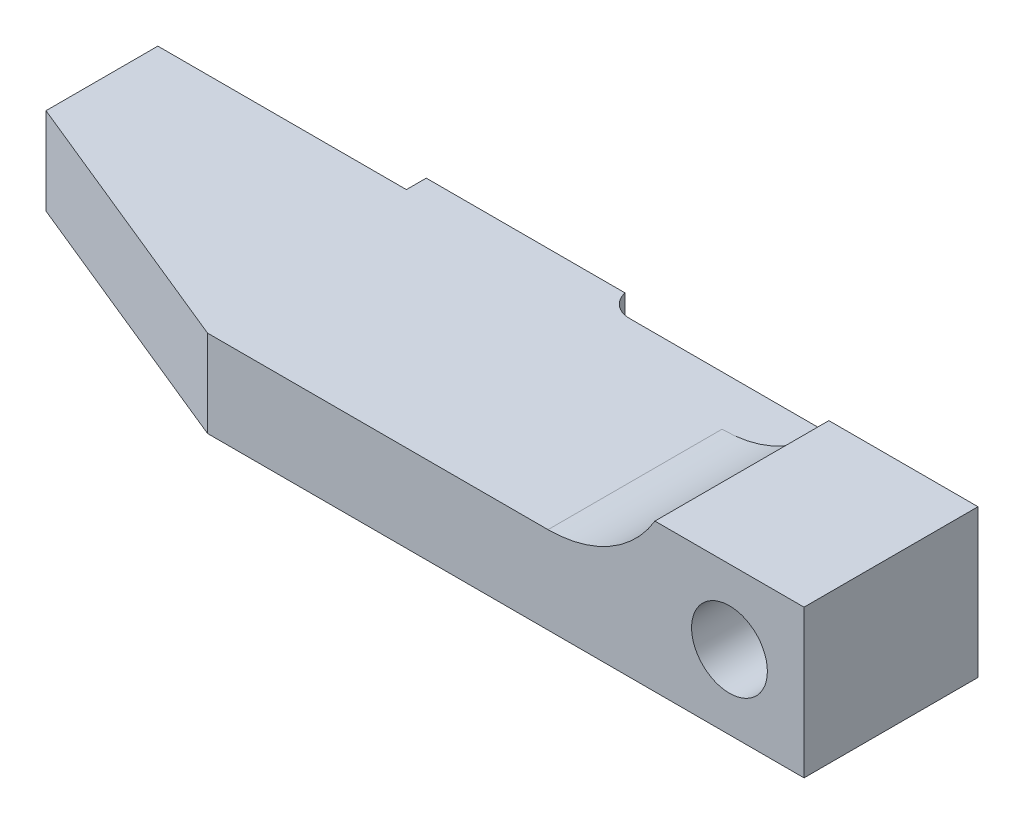
ISO-10303-21;
HEADER;
FILE_DESCRIPTION(('STEP AP214'),'2;1');
FILE_NAME('part.step','',(''),(''),'','','');
FILE_SCHEMA(('AUTOMOTIVE_DESIGN { 1 0 10303 214 1 1 1 1 }'));
ENDSEC;
DATA;
#1=APPLICATION_CONTEXT('core data for automotive mechanical design processes');
#2=APPLICATION_PROTOCOL_DEFINITION('international standard','automotive_design',2000,#1);
#3=PRODUCT_CONTEXT('',#1,'mechanical');
#4=PRODUCT('Part','Part','',(#3));
#5=PRODUCT_RELATED_PRODUCT_CATEGORY('part','',(#4));
#6=PRODUCT_DEFINITION_FORMATION('','',#4);
#7=PRODUCT_DEFINITION_CONTEXT('part definition',#1,'design');
#8=PRODUCT_DEFINITION('design','',#6,#7);
#9=PRODUCT_DEFINITION_SHAPE('','',#8);
#10=(LENGTH_UNIT() NAMED_UNIT(*) SI_UNIT(.MILLI.,.METRE.));
#11=(NAMED_UNIT(*) PLANE_ANGLE_UNIT() SI_UNIT($,.RADIAN.));
#12=(NAMED_UNIT(*) SI_UNIT($,.STERADIAN.) SOLID_ANGLE_UNIT());
#13=UNCERTAINTY_MEASURE_WITH_UNIT(LENGTH_MEASURE(1.E-05),#10,'distance_accuracy_value','');
#14=(GEOMETRIC_REPRESENTATION_CONTEXT(3) GLOBAL_UNCERTAINTY_ASSIGNED_CONTEXT((#13)) GLOBAL_UNIT_ASSIGNED_CONTEXT((#10,
#11,#12)) REPRESENTATION_CONTEXT('',''));
#15=CARTESIAN_POINT('',(0.,0.,0.));
#16=DIRECTION('',(0.,0.,1.));
#17=DIRECTION('',(1.,0.,0.));
#18=AXIS2_PLACEMENT_3D('',#15,#16,#17);
#19=CARTESIAN_POINT('',(0.,0.,0.));
#20=DIRECTION('',(0.,1.,0.));
#21=DIRECTION('',(0.,0.,1.));
#22=AXIS2_PLACEMENT_3D('',#19,#20,#21);
#23=PLANE('',#22);
#24=DIRECTION('',(-1.,0.,0.));
#25=VECTOR('',#24,1.);
#26=CARTESIAN_POINT('',(0.,0.,-9.));
#27=LINE('',#26,#25);
#28=CARTESIAN_POINT('',(-7.,0.,-9.));
#29=VERTEX_POINT('',#28);
#30=CARTESIAN_POINT('',(-16.0202041028867,0.,-9.));
#31=VERTEX_POINT('',#30);
#32=EDGE_CURVE('E208',#29,#31,#27,.T.);
#33=ORIENTED_EDGE('',*,*,#32,.F.);
#34=CARTESIAN_POINT('',(-7.,0.,-8.));
#35=DIRECTION('',(0.,1.,0.));
#36=DIRECTION('',(0.,0.,1.));
#37=AXIS2_PLACEMENT_3D('',#34,#35,#36);
#38=CIRCLE('',#37,1.);
#39=CARTESIAN_POINT('',(-6.,0.,-8.));
#40=VERTEX_POINT('',#39);
#41=EDGE_CURVE('E161',#29,#40,#38,.F.);
#42=ORIENTED_EDGE('',*,*,#41,.T.);
#43=DIRECTION('',(0.,0.,-1.));
#44=VECTOR('',#43,1.);
#45=CARTESIAN_POINT('',(-6.,0.,-7.));
#46=LINE('',#45,#44);
#47=CARTESIAN_POINT('',(-6.,0.,-7.));
#48=VERTEX_POINT('',#47);
#49=EDGE_CURVE('E144',#48,#40,#46,.T.);
#50=ORIENTED_EDGE('',*,*,#49,.F.);
#51=DIRECTION('',(1.,0.,0.));
#52=VECTOR('',#51,1.);
#53=CARTESIAN_POINT('',(-6.,0.,-7.));
#54=LINE('',#53,#52);
#55=CARTESIAN_POINT('',(0.,0.,-7.));
#56=VERTEX_POINT('',#55);
#57=EDGE_CURVE('E150',#48,#56,#54,.T.);
#58=ORIENTED_EDGE('',*,*,#57,.T.);
#59=DIRECTION('',(0.,0.,-1.));
#60=VECTOR('',#59,1.);
#61=CARTESIAN_POINT('',(0.,0.,0.));
#62=LINE('',#61,#60);
#63=CARTESIAN_POINT('',(0.,0.,0.));
#64=VERTEX_POINT('',#63);
#65=EDGE_CURVE('E190',#64,#56,#62,.T.);
#66=ORIENTED_EDGE('',*,*,#65,.F.);
#67=DIRECTION('',(1.,0.,0.));
#68=VECTOR('',#67,1.);
#69=CARTESIAN_POINT('',(-8.,0.,0.));
#70=LINE('',#69,#68);
#71=CARTESIAN_POINT('',(-24.,0.,0.));
#72=VERTEX_POINT('',#71);
#73=EDGE_CURVE('E195',#72,#64,#70,.T.);
#74=ORIENTED_EDGE('',*,*,#73,.F.);
#75=DIRECTION('',(0.925546956205677,0.,0.378632845720504));
#76=VECTOR('',#75,1.);
#77=CARTESIAN_POINT('',(-24.,0.,0.));
#78=LINE('',#77,#76);
#79=CARTESIAN_POINT('',(-35.,0.,-4.5));
#80=VERTEX_POINT('',#79);
#81=EDGE_CURVE('E216',#80,#72,#78,.T.);
#82=ORIENTED_EDGE('',*,*,#81,.F.);
#83=DIRECTION('',(0.,0.,1.));
#84=VECTOR('',#83,1.);
#85=CARTESIAN_POINT('',(-35.,0.,-9.));
#86=LINE('',#85,#84);
#87=CARTESIAN_POINT('',(-35.,0.,-9.));
#88=VERTEX_POINT('',#87);
#89=EDGE_CURVE('E214',#88,#80,#86,.T.);
#90=ORIENTED_EDGE('',*,*,#89,.F.);
#91=DIRECTION('',(-1.,0.,0.));
#92=VECTOR('',#91,1.);
#93=CARTESIAN_POINT('',(-34.,0.,-9.));
#94=LINE('',#93,#92);
#95=CARTESIAN_POINT('',(-25.,0.,-9.));
#96=VERTEX_POINT('',#95);
#97=EDGE_CURVE('E212',#96,#88,#94,.T.);
#98=ORIENTED_EDGE('',*,*,#97,.F.);
#99=DIRECTION('',(0.,0.,1.));
#100=VECTOR('',#99,1.);
#101=CARTESIAN_POINT('',(-25.,0.,-12.));
#102=LINE('',#101,#100);
#103=CARTESIAN_POINT('',(-25.,0.,-9.8));
#104=VERTEX_POINT('',#103);
#105=EDGE_CURVE('E210',#104,#96,#102,.T.);
#106=ORIENTED_EDGE('',*,*,#105,.F.);
#107=DIRECTION('',(1.,0.,0.));
#108=VECTOR('',#107,1.);
#109=CARTESIAN_POINT('',(-25.,0.,-9.8));
#110=LINE('',#109,#108);
#111=CARTESIAN_POINT('',(-17.,0.,-9.8));
#112=VERTEX_POINT('',#111);
#113=EDGE_CURVE('E165',#104,#112,#110,.T.);
#114=ORIENTED_EDGE('',*,*,#113,.T.);
#115=CARTESIAN_POINT('',(-16.0202041028867,0.,-10.));
#116=DIRECTION('',(0.,1.,0.));
#117=DIRECTION('',(0.,0.,1.));
#118=AXIS2_PLACEMENT_3D('',#115,#116,#117);
#119=CIRCLE('',#118,1.);
#120=EDGE_CURVE('E44',#112,#31,#119,.T.);
#121=ORIENTED_EDGE('',*,*,#120,.T.);
#122=EDGE_LOOP('',(#33,#42,#50,#58,#66,#74,#82,#90,#98,#106,#114,#121));
#123=FACE_BOUND('',#122,.T.);
#124=ADVANCED_FACE('F36',(#123),#23,.F.);
#125=CARTESIAN_POINT('',(0.,3.5,-9.));
#126=DIRECTION('',(0.,0.,1.));
#127=DIRECTION('',(1.,0.,0.));
#128=AXIS2_PLACEMENT_3D('',#125,#126,#127);
#129=PLANE('',#128);
#130=ORIENTED_EDGE('',*,*,#32,.T.);
#131=DIRECTION('',(0.,-1.,0.));
#132=VECTOR('',#131,1.);
#133=CARTESIAN_POINT('',(-16.0202041028867,3.5,-9.));
#134=LINE('',#133,#132);
#135=CARTESIAN_POINT('',(-16.0202041028867,3.5,-9.));
#136=VERTEX_POINT('',#135);
#137=EDGE_CURVE('E57',#31,#136,#134,.F.);
#138=ORIENTED_EDGE('',*,*,#137,.T.);
#139=DIRECTION('',(-1.,0.,0.));
#140=VECTOR('',#139,1.);
#141=CARTESIAN_POINT('',(0.,3.5,-9.));
#142=LINE('',#141,#140);
#143=CARTESIAN_POINT('',(-7.,3.5,-9.));
#144=VERTEX_POINT('',#143);
#145=EDGE_CURVE('E194',#144,#136,#142,.T.);
#146=ORIENTED_EDGE('',*,*,#145,.F.);
#147=DIRECTION('',(0.,-1.,0.));
#148=VECTOR('',#147,1.);
#149=CARTESIAN_POINT('',(-7.,0.,-9.));
#150=LINE('',#149,#148);
#151=EDGE_CURVE('E243',#144,#29,#150,.T.);
#152=ORIENTED_EDGE('',*,*,#151,.T.);
#153=EDGE_LOOP('',(#130,#138,#146,#152));
#154=FACE_BOUND('',#153,.T.);
#155=ADVANCED_FACE('F303',(#154),#129,.F.);
#156=CARTESIAN_POINT('',(0.,3.5,0.));
#157=DIRECTION('',(0.,1.,0.));
#158=DIRECTION('',(0.,0.,1.));
#159=AXIS2_PLACEMENT_3D('',#156,#157,#158);
#160=PLANE('',#159);
#161=DIRECTION('',(1.,0.,0.));
#162=VECTOR('',#161,1.);
#163=CARTESIAN_POINT('',(0.,3.5,-7.));
#164=LINE('',#163,#162);
#165=CARTESIAN_POINT('',(-10.3008720046056,3.5,-7.));
#166=VERTEX_POINT('',#165);
#167=CARTESIAN_POINT('',(-7.,3.5,-7.));
#168=VERTEX_POINT('',#167);
#169=EDGE_CURVE('E232',#166,#168,#164,.T.);
#170=ORIENTED_EDGE('',*,*,#169,.T.);
#171=DIRECTION('',(0.,0.,-1.));
#172=VECTOR('',#171,1.);
#173=CARTESIAN_POINT('',(-7.,3.5,0.));
#174=LINE('',#173,#172);
#175=EDGE_CURVE('E250',#168,#144,#174,.T.);
#176=ORIENTED_EDGE('',*,*,#175,.T.);
#177=ORIENTED_EDGE('',*,*,#145,.T.);
#178=CARTESIAN_POINT('',(-16.0202041028867,3.5,-10.));
#179=DIRECTION('',(0.,1.,0.));
#180=DIRECTION('',(0.,0.,1.));
#181=AXIS2_PLACEMENT_3D('',#178,#179,#180);
#182=CIRCLE('',#181,1.);
#183=CARTESIAN_POINT('',(-17.,3.5,-9.8));
#184=VERTEX_POINT('',#183);
#185=EDGE_CURVE('E11',#136,#184,#182,.F.);
#186=ORIENTED_EDGE('',*,*,#185,.T.);
#187=DIRECTION('',(-1.,0.,0.));
#188=VECTOR('',#187,1.);
#189=CARTESIAN_POINT('',(0.,3.5,-9.8));
#190=LINE('',#189,#188);
#191=CARTESIAN_POINT('',(-25.,3.5,-9.8));
#192=VERTEX_POINT('',#191);
#193=EDGE_CURVE('E176',#184,#192,#190,.T.);
#194=ORIENTED_EDGE('',*,*,#193,.T.);
#195=DIRECTION('',(0.,0.,1.));
#196=VECTOR('',#195,1.);
#197=CARTESIAN_POINT('',(-25.,3.5,-12.));
#198=LINE('',#197,#196);
#199=CARTESIAN_POINT('',(-25.,3.5,-9.));
#200=VERTEX_POINT('',#199);
#201=EDGE_CURVE('E197',#192,#200,#198,.T.);
#202=ORIENTED_EDGE('',*,*,#201,.T.);
#203=DIRECTION('',(-1.,0.,0.));
#204=VECTOR('',#203,1.);
#205=CARTESIAN_POINT('',(-34.,3.5,-9.));
#206=LINE('',#205,#204);
#207=CARTESIAN_POINT('',(-35.,3.5,-9.));
#208=VERTEX_POINT('',#207);
#209=EDGE_CURVE('E199',#200,#208,#206,.T.);
#210=ORIENTED_EDGE('',*,*,#209,.T.);
#211=DIRECTION('',(0.,0.,1.));
#212=VECTOR('',#211,1.);
#213=CARTESIAN_POINT('',(-35.,3.5,-9.));
#214=LINE('',#213,#212);
#215=CARTESIAN_POINT('',(-35.,3.5,-4.5));
#216=VERTEX_POINT('',#215);
#217=EDGE_CURVE('E201',#208,#216,#214,.T.);
#218=ORIENTED_EDGE('',*,*,#217,.T.);
#219=DIRECTION('',(0.925546956205677,0.,0.378632845720504));
#220=VECTOR('',#219,1.);
#221=CARTESIAN_POINT('',(-24.,3.5,0.));
#222=LINE('',#221,#220);
#223=CARTESIAN_POINT('',(-24.,3.5,0.));
#224=VERTEX_POINT('',#223);
#225=EDGE_CURVE('E203',#216,#224,#222,.T.);
#226=ORIENTED_EDGE('',*,*,#225,.T.);
#227=DIRECTION('',(1.,0.,0.));
#228=VECTOR('',#227,1.);
#229=CARTESIAN_POINT('',(0.,3.5,0.));
#230=LINE('',#229,#228);
#231=CARTESIAN_POINT('',(-10.3008720046056,3.5,0.));
#232=VERTEX_POINT('',#231);
#233=EDGE_CURVE('E191',#224,#232,#230,.T.);
#234=ORIENTED_EDGE('',*,*,#233,.T.);
#235=DIRECTION('',(0.,0.,1.));
#236=VECTOR('',#235,1.);
#237=CARTESIAN_POINT('',(-10.3008720046056,3.5,-7.));
#238=LINE('',#237,#236);
#239=EDGE_CURVE('E236',#232,#166,#238,.F.);
#240=ORIENTED_EDGE('',*,*,#239,.T.);
#241=EDGE_LOOP('',(#170,#176,#177,#186,#194,#202,#210,#218,#226,#234,#240));
#242=FACE_BOUND('',#241,.T.);
#243=ADVANCED_FACE('F275',(#242),#160,.T.);
#244=CARTESIAN_POINT('',(-25.,3.5,-12.));
#245=DIRECTION('',(1.,0.,0.));
#246=DIRECTION('',(0.,0.,-1.));
#247=AXIS2_PLACEMENT_3D('',#244,#245,#246);
#248=PLANE('',#247);
#249=DIRECTION('',(0.,-1.,0.));
#250=VECTOR('',#249,1.);
#251=CARTESIAN_POINT('',(-25.,10.,-9.8));
#252=LINE('',#251,#250);
#253=EDGE_CURVE('E173',#192,#104,#252,.T.);
#254=ORIENTED_EDGE('',*,*,#253,.T.);
#255=ORIENTED_EDGE('',*,*,#105,.T.);
#256=DIRECTION('',(0.,-1.,0.));
#257=VECTOR('',#256,1.);
#258=CARTESIAN_POINT('',(-25.,3.5,-9.));
#259=LINE('',#258,#257);
#260=EDGE_CURVE('E227',#200,#96,#259,.T.);
#261=ORIENTED_EDGE('',*,*,#260,.F.);
#262=ORIENTED_EDGE('',*,*,#201,.F.);
#263=EDGE_LOOP('',(#254,#255,#261,#262));
#264=FACE_BOUND('',#263,.T.);
#265=ADVANCED_FACE('F289',(#264),#248,.F.);
#266=CARTESIAN_POINT('',(0.,3.5,0.));
#267=DIRECTION('',(-1.,0.,0.));
#268=DIRECTION('',(0.,0.,1.));
#269=AXIS2_PLACEMENT_3D('',#266,#267,#268);
#270=PLANE('',#269);
#271=ORIENTED_EDGE('',*,*,#65,.T.);
#272=DIRECTION('',(0.,1.,0.));
#273=VECTOR('',#272,1.);
#274=CARTESIAN_POINT('',(0.,0.,-7.));
#275=LINE('',#274,#273);
#276=CARTESIAN_POINT('',(0.,5.95,-7.));
#277=VERTEX_POINT('',#276);
#278=EDGE_CURVE('E157',#56,#277,#275,.T.);
#279=ORIENTED_EDGE('',*,*,#278,.T.);
#280=DIRECTION('',(0.,0.,-1.));
#281=VECTOR('',#280,1.);
#282=CARTESIAN_POINT('',(0.,5.95,-9.));
#283=LINE('',#282,#281);
#284=CARTESIAN_POINT('',(0.,5.95,0.));
#285=VERTEX_POINT('',#284);
#286=EDGE_CURVE('E182',#285,#277,#283,.T.);
#287=ORIENTED_EDGE('',*,*,#286,.F.);
#288=DIRECTION('',(0.,-1.,0.));
#289=VECTOR('',#288,1.);
#290=CARTESIAN_POINT('',(0.,3.5,0.));
#291=LINE('',#290,#289);
#292=EDGE_CURVE('E230',#285,#64,#291,.T.);
#293=ORIENTED_EDGE('',*,*,#292,.T.);
#294=EDGE_LOOP('',(#271,#279,#287,#293));
#295=FACE_BOUND('',#294,.T.);
#296=ADVANCED_FACE('F286',(#295),#270,.F.);
#297=CARTESIAN_POINT('',(-34.,3.5,-9.));
#298=DIRECTION('',(0.,0.,1.));
#299=DIRECTION('',(1.,0.,0.));
#300=AXIS2_PLACEMENT_3D('',#297,#298,#299);
#301=PLANE('',#300);
#302=ORIENTED_EDGE('',*,*,#97,.T.);
#303=DIRECTION('',(0.,-1.,0.));
#304=VECTOR('',#303,1.);
#305=CARTESIAN_POINT('',(-35.,3.5,-9.));
#306=LINE('',#305,#304);
#307=EDGE_CURVE('E224',#208,#88,#306,.T.);
#308=ORIENTED_EDGE('',*,*,#307,.F.);
#309=ORIENTED_EDGE('',*,*,#209,.F.);
#310=ORIENTED_EDGE('',*,*,#260,.T.);
#311=EDGE_LOOP('',(#302,#308,#309,#310));
#312=FACE_BOUND('',#311,.T.);
#313=ADVANCED_FACE('F288',(#312),#301,.F.);
#314=CARTESIAN_POINT('',(-35.,3.5,-9.));
#315=DIRECTION('',(1.,0.,0.));
#316=DIRECTION('',(0.,0.,-1.));
#317=AXIS2_PLACEMENT_3D('',#314,#315,#316);
#318=PLANE('',#317);
#319=ORIENTED_EDGE('',*,*,#89,.T.);
#320=DIRECTION('',(0.,-1.,0.));
#321=VECTOR('',#320,1.);
#322=CARTESIAN_POINT('',(-35.,3.5,-4.5));
#323=LINE('',#322,#321);
#324=EDGE_CURVE('E221',#216,#80,#323,.T.);
#325=ORIENTED_EDGE('',*,*,#324,.F.);
#326=ORIENTED_EDGE('',*,*,#217,.F.);
#327=ORIENTED_EDGE('',*,*,#307,.T.);
#328=EDGE_LOOP('',(#319,#325,#326,#327));
#329=FACE_BOUND('',#328,.T.);
#330=ADVANCED_FACE('F295',(#329),#318,.F.);
#331=CARTESIAN_POINT('',(-24.,3.5,0.));
#332=DIRECTION('',(0.378632845720504,0.,-0.925546956205677));
#333=DIRECTION('',(-0.925546956205677,0.,-0.378632845720504));
#334=AXIS2_PLACEMENT_3D('',#331,#332,#333);
#335=PLANE('',#334);
#336=ORIENTED_EDGE('',*,*,#81,.T.);
#337=DIRECTION('',(0.,-1.,0.));
#338=VECTOR('',#337,1.);
#339=CARTESIAN_POINT('',(-24.,3.5,0.));
#340=LINE('',#339,#338);
#341=EDGE_CURVE('E206',#224,#72,#340,.T.);
#342=ORIENTED_EDGE('',*,*,#341,.F.);
#343=ORIENTED_EDGE('',*,*,#225,.F.);
#344=ORIENTED_EDGE('',*,*,#324,.T.);
#345=EDGE_LOOP('',(#336,#342,#343,#344));
#346=FACE_BOUND('',#345,.T.);
#347=ADVANCED_FACE('F281',(#346),#335,.F.);
#348=CARTESIAN_POINT('',(-8.,3.5,0.));
#349=DIRECTION('',(0.,0.,-1.));
#350=DIRECTION('',(-1.,0.,0.));
#351=AXIS2_PLACEMENT_3D('',#348,#349,#350);
#352=PLANE('',#351);
#353=CARTESIAN_POINT('',(-3.,2.975,0.));
#354=DIRECTION('',(0.,0.,1.));
#355=DIRECTION('',(1.,0.,0.));
#356=AXIS2_PLACEMENT_3D('',#353,#354,#355);
#357=CIRCLE('',#356,1.525);
#358=CARTESIAN_POINT('',(-1.475,2.975,0.));
#359=VERTEX_POINT('',#358);
#360=EDGE_CURVE('E179',#359,#359,#357,.T.);
#361=ORIENTED_EDGE('',*,*,#360,.F.);
#362=EDGE_LOOP('',(#361));
#363=FACE_BOUND('',#362,.T.);
#364=ORIENTED_EDGE('',*,*,#292,.F.);
#365=DIRECTION('',(1.,0.,0.));
#366=VECTOR('',#365,1.);
#367=CARTESIAN_POINT('',(0.,5.95,0.));
#368=LINE('',#367,#366);
#369=CARTESIAN_POINT('',(-6.,5.95,0.));
#370=VERTEX_POINT('',#369);
#371=EDGE_CURVE('E187',#370,#285,#368,.T.);
#372=ORIENTED_EDGE('',*,*,#371,.F.);
#373=CARTESIAN_POINT('',(-10.3008720046056,8.5,0.));
#374=DIRECTION('',(0.,0.,-1.));
#375=DIRECTION('',(-1.,0.,0.));
#376=AXIS2_PLACEMENT_3D('',#373,#374,#375);
#377=CIRCLE('',#376,5.);
#378=EDGE_CURVE('E241',#370,#232,#377,.T.);
#379=ORIENTED_EDGE('',*,*,#378,.T.);
#380=ORIENTED_EDGE('',*,*,#233,.F.);
#381=ORIENTED_EDGE('',*,*,#341,.T.);
#382=ORIENTED_EDGE('',*,*,#73,.T.);
#383=EDGE_LOOP('',(#364,#372,#379,#380,#381,#382));
#384=FACE_BOUND('',#383,.T.);
#385=ADVANCED_FACE('F273',(#363,#384),#352,.F.);
#386=CARTESIAN_POINT('',(0.,5.95,0.));
#387=DIRECTION('',(0.,-1.,0.));
#388=DIRECTION('',(0.,0.,-1.));
#389=AXIS2_PLACEMENT_3D('',#386,#387,#388);
#390=PLANE('',#389);
#391=ORIENTED_EDGE('',*,*,#286,.T.);
#392=DIRECTION('',(-1.,0.,0.));
#393=VECTOR('',#392,1.);
#394=CARTESIAN_POINT('',(0.,5.95,-7.));
#395=LINE('',#394,#393);
#396=CARTESIAN_POINT('',(-6.,5.95,-7.));
#397=VERTEX_POINT('',#396);
#398=EDGE_CURVE('E151',#277,#397,#395,.T.);
#399=ORIENTED_EDGE('',*,*,#398,.T.);
#400=DIRECTION('',(0.,0.,1.));
#401=VECTOR('',#400,1.);
#402=CARTESIAN_POINT('',(-6.,5.95,0.));
#403=LINE('',#402,#401);
#404=EDGE_CURVE('E185',#397,#370,#403,.T.);
#405=ORIENTED_EDGE('',*,*,#404,.T.);
#406=ORIENTED_EDGE('',*,*,#371,.T.);
#407=EDGE_LOOP('',(#391,#399,#405,#406));
#408=FACE_BOUND('',#407,.T.);
#409=ADVANCED_FACE('F264',(#408),#390,.F.);
#410=CARTESIAN_POINT('',(-3.,2.975,-12.));
#411=DIRECTION('',(0.,0.,1.));
#412=DIRECTION('',(1.,0.,0.));
#413=AXIS2_PLACEMENT_3D('',#410,#411,#412);
#414=CYLINDRICAL_SURFACE('',#413,1.525);
#415=CARTESIAN_POINT('',(-3.,2.975,-7.));
#416=DIRECTION('',(0.,0.,1.));
#417=DIRECTION('',(1.,0.,0.));
#418=AXIS2_PLACEMENT_3D('',#415,#416,#417);
#419=CIRCLE('',#418,1.525);
#420=CARTESIAN_POINT('',(-1.475,2.975,-7.));
#421=VERTEX_POINT('',#420);
#422=EDGE_CURVE('E162',#421,#421,#419,.F.);
#423=ORIENTED_EDGE('',*,*,#422,.T.);
#424=EDGE_LOOP('',(#423));
#425=FACE_BOUND('',#424,.T.);
#426=ORIENTED_EDGE('',*,*,#360,.T.);
#427=EDGE_LOOP('',(#426));
#428=FACE_BOUND('',#427,.T.);
#429=ADVANCED_FACE('F355',(#425,#428),#414,.F.);
#430=CARTESIAN_POINT('',(-25.,10.,-9.8));
#431=DIRECTION('',(0.,0.,-1.));
#432=DIRECTION('',(-1.,0.,0.));
#433=AXIS2_PLACEMENT_3D('',#430,#431,#432);
#434=PLANE('',#433);
#435=DIRECTION('',(0.,-1.,0.));
#436=VECTOR('',#435,1.);
#437=CARTESIAN_POINT('',(-17.,10.,-9.8));
#438=LINE('',#437,#436);
#439=EDGE_CURVE('E170',#184,#112,#438,.T.);
#440=ORIENTED_EDGE('',*,*,#439,.T.);
#441=ORIENTED_EDGE('',*,*,#113,.F.);
#442=ORIENTED_EDGE('',*,*,#253,.F.);
#443=ORIENTED_EDGE('',*,*,#193,.F.);
#444=EDGE_LOOP('',(#440,#441,#442,#443));
#445=FACE_BOUND('',#444,.T.);
#446=ADVANCED_FACE('F328',(#445),#434,.T.);
#447=CARTESIAN_POINT('',(0.,0.,-7.));
#448=DIRECTION('',(0.,0.,1.));
#449=DIRECTION('',(1.,0.,0.));
#450=AXIS2_PLACEMENT_3D('',#447,#448,#449);
#451=PLANE('',#450);
#452=ORIENTED_EDGE('',*,*,#398,.F.);
#453=ORIENTED_EDGE('',*,*,#278,.F.);
#454=ORIENTED_EDGE('',*,*,#57,.F.);
#455=DIRECTION('',(0.,-1.,0.));
#456=VECTOR('',#455,1.);
#457=CARTESIAN_POINT('',(-6.,5.95,-7.));
#458=LINE('',#457,#456);
#459=CARTESIAN_POINT('',(-6.,2.5,-7.));
#460=VERTEX_POINT('',#459);
#461=EDGE_CURVE('E140',#460,#48,#458,.T.);
#462=ORIENTED_EDGE('',*,*,#461,.F.);
#463=CARTESIAN_POINT('',(-7.,2.5,-7.));
#464=DIRECTION('',(0.,0.,1.));
#465=DIRECTION('',(1.,0.,0.));
#466=AXIS2_PLACEMENT_3D('',#463,#464,#465);
#467=CIRCLE('',#466,1.);
#468=EDGE_CURVE('E252',#460,#168,#467,.T.);
#469=ORIENTED_EDGE('',*,*,#468,.T.);
#470=ORIENTED_EDGE('',*,*,#169,.F.);
#471=CARTESIAN_POINT('',(-10.3008720046056,8.5,-7.));
#472=DIRECTION('',(0.,0.,1.));
#473=DIRECTION('',(1.,0.,0.));
#474=AXIS2_PLACEMENT_3D('',#471,#472,#473);
#475=CIRCLE('',#474,5.);
#476=EDGE_CURVE('E239',#166,#397,#475,.T.);
#477=ORIENTED_EDGE('',*,*,#476,.T.);
#478=EDGE_LOOP('',(#452,#453,#454,#462,#469,#470,#477));
#479=FACE_BOUND('',#478,.T.);
#480=ORIENTED_EDGE('',*,*,#422,.F.);
#481=EDGE_LOOP('',(#480));
#482=FACE_BOUND('',#481,.T.);
#483=ADVANCED_FACE('F154',(#479,#482),#451,.F.);
#484=CARTESIAN_POINT('',(-6.,5.95,-7.));
#485=DIRECTION('',(1.,0.,0.));
#486=DIRECTION('',(0.,0.,-1.));
#487=AXIS2_PLACEMENT_3D('',#484,#485,#486);
#488=PLANE('',#487);
#489=ORIENTED_EDGE('',*,*,#49,.T.);
#490=DIRECTION('',(0.,-1.,0.));
#491=VECTOR('',#490,1.);
#492=CARTESIAN_POINT('',(-6.,3.5,-8.));
#493=LINE('',#492,#491);
#494=CARTESIAN_POINT('',(-6.,2.5,-8.));
#495=VERTEX_POINT('',#494);
#496=EDGE_CURVE('E248',#40,#495,#493,.F.);
#497=ORIENTED_EDGE('',*,*,#496,.T.);
#498=DIRECTION('',(0.,0.,-1.));
#499=VECTOR('',#498,1.);
#500=CARTESIAN_POINT('',(-6.,2.5,-7.));
#501=LINE('',#500,#499);
#502=EDGE_CURVE('E147',#495,#460,#501,.F.);
#503=ORIENTED_EDGE('',*,*,#502,.T.);
#504=ORIENTED_EDGE('',*,*,#461,.T.);
#505=EDGE_LOOP('',(#489,#497,#503,#504));
#506=FACE_BOUND('',#505,.T.);
#507=ADVANCED_FACE('F142',(#506),#488,.T.);
#508=CARTESIAN_POINT('',(-10.3008720046056,8.5,0.));
#509=DIRECTION('',(0.,0.,-1.));
#510=DIRECTION('',(-1.,0.,0.));
#511=AXIS2_PLACEMENT_3D('',#508,#509,#510);
#512=CYLINDRICAL_SURFACE('',#511,5.);
#513=ORIENTED_EDGE('',*,*,#378,.F.);
#514=ORIENTED_EDGE('',*,*,#404,.F.);
#515=ORIENTED_EDGE('',*,*,#476,.F.);
#516=ORIENTED_EDGE('',*,*,#239,.F.);
#517=EDGE_LOOP('',(#513,#514,#515,#516));
#518=FACE_BOUND('',#517,.T.);
#519=ADVANCED_FACE('F269',(#518),#512,.F.);
#520=CARTESIAN_POINT('',(-7.,2.5,0.));
#521=DIRECTION('',(0.,0.,-1.));
#522=DIRECTION('',(-1.,0.,0.));
#523=AXIS2_PLACEMENT_3D('',#520,#521,#522);
#524=CYLINDRICAL_SURFACE('',#523,1.);
#525=ORIENTED_EDGE('',*,*,#468,.F.);
#526=ORIENTED_EDGE('',*,*,#502,.F.);
#527=CARTESIAN_POINT('',(-7.,2.5,-8.));
#528=DIRECTION('',(0.,-0.707106781186547,-0.707106781186547));
#529=DIRECTION('',(0.,0.707106781186547,-0.707106781186547));
#530=AXIS2_PLACEMENT_3D('',#527,#528,#529);
#531=ELLIPSE('',#530,1.41421356237309,1.);
#532=EDGE_CURVE('E254',#144,#495,#531,.T.);
#533=ORIENTED_EDGE('',*,*,#532,.F.);
#534=ORIENTED_EDGE('',*,*,#175,.F.);
#535=EDGE_LOOP('',(#525,#526,#533,#534));
#536=FACE_BOUND('',#535,.T.);
#537=ADVANCED_FACE('F337',(#536),#524,.T.);
#538=CARTESIAN_POINT('',(-7.,3.5,-8.));
#539=DIRECTION('',(0.,1.,0.));
#540=DIRECTION('',(0.,0.,1.));
#541=AXIS2_PLACEMENT_3D('',#538,#539,#540);
#542=CYLINDRICAL_SURFACE('',#541,1.);
#543=ORIENTED_EDGE('',*,*,#532,.T.);
#544=ORIENTED_EDGE('',*,*,#496,.F.);
#545=ORIENTED_EDGE('',*,*,#41,.F.);
#546=ORIENTED_EDGE('',*,*,#151,.F.);
#547=EDGE_LOOP('',(#543,#544,#545,#546));
#548=FACE_BOUND('',#547,.T.);
#549=ADVANCED_FACE('F333',(#548),#542,.T.);
#550=CARTESIAN_POINT('',(-16.0202041028867,3.5,-10.));
#551=DIRECTION('',(0.,-1.,0.));
#552=DIRECTION('',(0.,0.,-1.));
#553=AXIS2_PLACEMENT_3D('',#550,#551,#552);
#554=CYLINDRICAL_SURFACE('',#553,1.);
#555=ORIENTED_EDGE('',*,*,#185,.F.);
#556=ORIENTED_EDGE('',*,*,#137,.F.);
#557=ORIENTED_EDGE('',*,*,#120,.F.);
#558=ORIENTED_EDGE('',*,*,#439,.F.);
#559=EDGE_LOOP('',(#555,#556,#557,#558));
#560=FACE_BOUND('',#559,.T.);
#561=ADVANCED_FACE('F38',(#560),#554,.F.);
#562=CLOSED_SHELL('',(#124,#155,#243,#265,#296,#313,#330,#347,#385,#409,#429,#446,#483,#507,
#519,#537,#549,#561));
#563=MANIFOLD_SOLID_BREP('B2',#562);
#564=ADVANCED_BREP_SHAPE_REPRESENTATION('',(#18,#563),#14);
#565=SHAPE_DEFINITION_REPRESENTATION(#9,#564);
ENDSEC;
END-ISO-10303-21;
